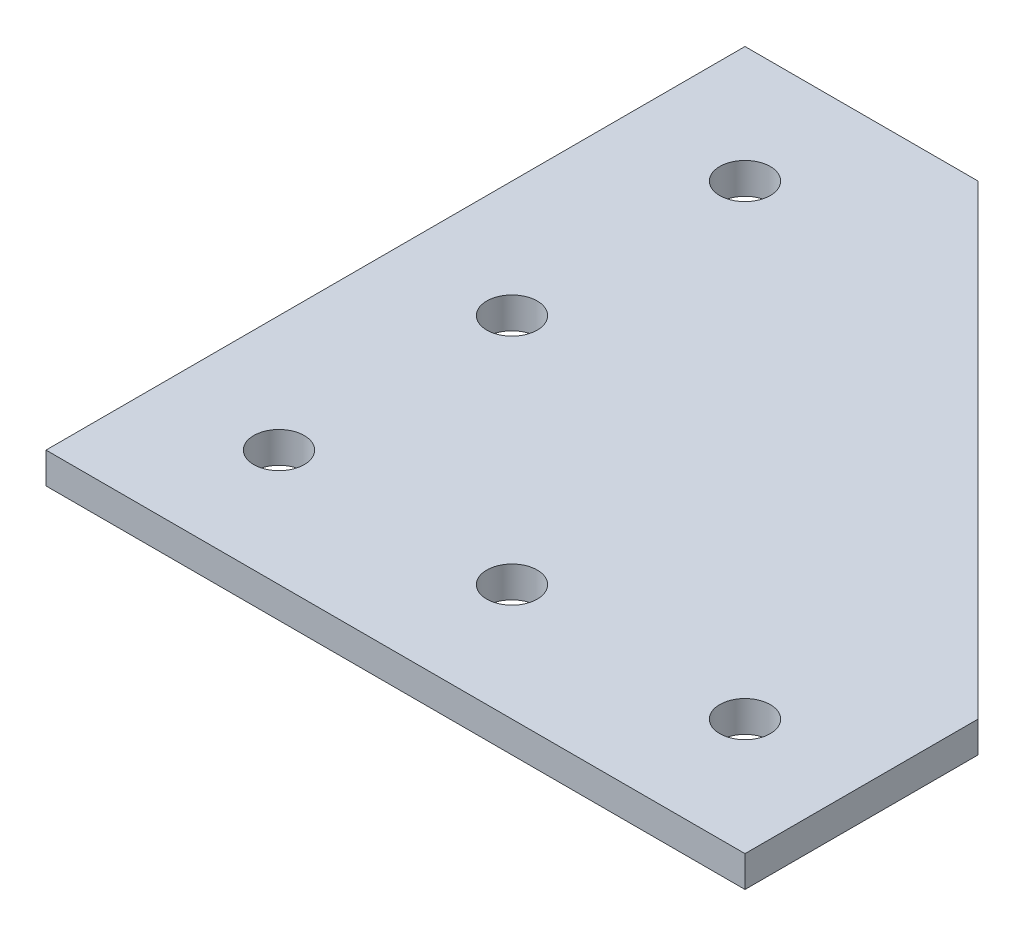
ISO-10303-21;
HEADER;
FILE_DESCRIPTION(('STEP AP214'),'2;1');
FILE_NAME('part.step','',(''),(''),'','','');
FILE_SCHEMA(('AUTOMOTIVE_DESIGN { 1 0 10303 214 1 1 1 1 }'));
ENDSEC;
DATA;
#1=APPLICATION_CONTEXT('core data for automotive mechanical design processes');
#2=APPLICATION_PROTOCOL_DEFINITION('international standard','automotive_design',2000,#1);
#3=PRODUCT_CONTEXT('',#1,'mechanical');
#4=PRODUCT('Part','Part','',(#3));
#5=PRODUCT_RELATED_PRODUCT_CATEGORY('part','',(#4));
#6=PRODUCT_DEFINITION_FORMATION('','',#4);
#7=PRODUCT_DEFINITION_CONTEXT('part definition',#1,'design');
#8=PRODUCT_DEFINITION('design','',#6,#7);
#9=PRODUCT_DEFINITION_SHAPE('','',#8);
#10=(LENGTH_UNIT() NAMED_UNIT(*) SI_UNIT(.MILLI.,.METRE.));
#11=(NAMED_UNIT(*) PLANE_ANGLE_UNIT() SI_UNIT($,.RADIAN.));
#12=(NAMED_UNIT(*) SI_UNIT($,.STERADIAN.) SOLID_ANGLE_UNIT());
#13=UNCERTAINTY_MEASURE_WITH_UNIT(LENGTH_MEASURE(1.E-05),#10,'distance_accuracy_value','');
#14=(GEOMETRIC_REPRESENTATION_CONTEXT(3) GLOBAL_UNCERTAINTY_ASSIGNED_CONTEXT((#13)) GLOBAL_UNIT_ASSIGNED_CONTEXT((#10,
#11,#12)) REPRESENTATION_CONTEXT('',''));
#15=CARTESIAN_POINT('',(0.,0.,0.));
#16=DIRECTION('',(0.,0.,1.));
#17=DIRECTION('',(1.,0.,0.));
#18=AXIS2_PLACEMENT_3D('',#15,#16,#17);
#19=CARTESIAN_POINT('',(0.,4.,-90.));
#20=DIRECTION('',(1.,0.,0.));
#21=DIRECTION('',(0.,0.,-1.));
#22=AXIS2_PLACEMENT_3D('',#19,#20,#21);
#23=PLANE('',#22);
#24=DIRECTION('',(0.,0.,1.));
#25=VECTOR('',#24,1.);
#26=CARTESIAN_POINT('',(0.,0.,-90.));
#27=LINE('',#26,#25);
#28=CARTESIAN_POINT('',(0.,0.,-90.));
#29=VERTEX_POINT('',#28);
#30=CARTESIAN_POINT('',(0.,0.,0.));
#31=VERTEX_POINT('',#30);
#32=EDGE_CURVE('E113',#29,#31,#27,.T.);
#33=ORIENTED_EDGE('',*,*,#32,.T.);
#34=DIRECTION('',(0.,-1.,0.));
#35=VECTOR('',#34,1.);
#36=CARTESIAN_POINT('',(0.,4.,0.));
#37=LINE('',#36,#35);
#38=CARTESIAN_POINT('',(0.,4.,0.));
#39=VERTEX_POINT('',#38);
#40=EDGE_CURVE('E11',#39,#31,#37,.T.);
#41=ORIENTED_EDGE('',*,*,#40,.F.);
#42=DIRECTION('',(0.,0.,1.));
#43=VECTOR('',#42,1.);
#44=CARTESIAN_POINT('',(0.,4.,-90.));
#45=LINE('',#44,#43);
#46=CARTESIAN_POINT('',(0.,4.,-90.));
#47=VERTEX_POINT('',#46);
#48=EDGE_CURVE('E122',#47,#39,#45,.T.);
#49=ORIENTED_EDGE('',*,*,#48,.F.);
#50=DIRECTION('',(0.,-1.,0.));
#51=VECTOR('',#50,1.);
#52=CARTESIAN_POINT('',(0.,4.,-90.));
#53=LINE('',#52,#51);
#54=EDGE_CURVE('E109',#47,#29,#53,.T.);
#55=ORIENTED_EDGE('',*,*,#54,.T.);
#56=EDGE_LOOP('',(#33,#41,#49,#55));
#57=FACE_BOUND('',#56,.T.);
#58=ADVANCED_FACE('F39',(#57),#23,.F.);
#59=CARTESIAN_POINT('',(0.,4.,0.));
#60=DIRECTION('',(0.,0.,-1.));
#61=DIRECTION('',(-1.,0.,0.));
#62=AXIS2_PLACEMENT_3D('',#59,#60,#61);
#63=PLANE('',#62);
#64=DIRECTION('',(1.,0.,0.));
#65=VECTOR('',#64,1.);
#66=CARTESIAN_POINT('',(0.,0.,0.));
#67=LINE('',#66,#65);
#68=CARTESIAN_POINT('',(90.,0.,0.));
#69=VERTEX_POINT('',#68);
#70=EDGE_CURVE('E116',#31,#69,#67,.T.);
#71=ORIENTED_EDGE('',*,*,#70,.T.);
#72=DIRECTION('',(0.,-1.,0.));
#73=VECTOR('',#72,1.);
#74=CARTESIAN_POINT('',(90.,4.,0.));
#75=LINE('',#74,#73);
#76=CARTESIAN_POINT('',(90.,4.,0.));
#77=VERTEX_POINT('',#76);
#78=EDGE_CURVE('E47',#77,#69,#75,.T.);
#79=ORIENTED_EDGE('',*,*,#78,.F.);
#80=DIRECTION('',(1.,0.,0.));
#81=VECTOR('',#80,1.);
#82=CARTESIAN_POINT('',(0.,4.,0.));
#83=LINE('',#82,#81);
#84=EDGE_CURVE('E89',#39,#77,#83,.T.);
#85=ORIENTED_EDGE('',*,*,#84,.F.);
#86=ORIENTED_EDGE('',*,*,#40,.T.);
#87=EDGE_LOOP('',(#71,#79,#85,#86));
#88=FACE_BOUND('',#87,.T.);
#89=ADVANCED_FACE('F142',(#88),#63,.F.);
#90=CARTESIAN_POINT('',(90.,4.,0.));
#91=DIRECTION('',(-1.,0.,0.));
#92=DIRECTION('',(0.,0.,1.));
#93=AXIS2_PLACEMENT_3D('',#90,#91,#92);
#94=PLANE('',#93);
#95=DIRECTION('',(0.,0.,-1.));
#96=VECTOR('',#95,1.);
#97=CARTESIAN_POINT('',(90.,0.,0.));
#98=LINE('',#97,#96);
#99=CARTESIAN_POINT('',(90.,0.,-30.));
#100=VERTEX_POINT('',#99);
#101=EDGE_CURVE('E104',#69,#100,#98,.T.);
#102=ORIENTED_EDGE('',*,*,#101,.T.);
#103=DIRECTION('',(0.,-1.,0.));
#104=VECTOR('',#103,1.);
#105=CARTESIAN_POINT('',(90.,4.,-30.));
#106=LINE('',#105,#104);
#107=CARTESIAN_POINT('',(90.,4.,-30.));
#108=VERTEX_POINT('',#107);
#109=EDGE_CURVE('E101',#108,#100,#106,.T.);
#110=ORIENTED_EDGE('',*,*,#109,.F.);
#111=DIRECTION('',(0.,0.,-1.));
#112=VECTOR('',#111,1.);
#113=CARTESIAN_POINT('',(90.,4.,0.));
#114=LINE('',#113,#112);
#115=EDGE_CURVE('E93',#77,#108,#114,.T.);
#116=ORIENTED_EDGE('',*,*,#115,.F.);
#117=ORIENTED_EDGE('',*,*,#78,.T.);
#118=EDGE_LOOP('',(#102,#110,#116,#117));
#119=FACE_BOUND('',#118,.T.);
#120=ADVANCED_FACE('F102',(#119),#94,.F.);
#121=CARTESIAN_POINT('',(90.,4.,-30.));
#122=DIRECTION('',(-0.707106781186547,0.,0.707106781186547));
#123=DIRECTION('',(0.707106781186548,0.,0.707106781186548));
#124=AXIS2_PLACEMENT_3D('',#121,#122,#123);
#125=PLANE('',#124);
#126=DIRECTION('',(-0.707106781186547,0.,-0.707106781186547));
#127=VECTOR('',#126,1.);
#128=CARTESIAN_POINT('',(90.,0.,-30.));
#129=LINE('',#128,#127);
#130=CARTESIAN_POINT('',(30.,0.,-90.));
#131=VERTEX_POINT('',#130);
#132=EDGE_CURVE('E75',#100,#131,#129,.T.);
#133=ORIENTED_EDGE('',*,*,#132,.T.);
#134=DIRECTION('',(0.,-1.,0.));
#135=VECTOR('',#134,1.);
#136=CARTESIAN_POINT('',(30.,4.,-90.));
#137=LINE('',#136,#135);
#138=CARTESIAN_POINT('',(30.,4.,-90.));
#139=VERTEX_POINT('',#138);
#140=EDGE_CURVE('E105',#139,#131,#137,.T.);
#141=ORIENTED_EDGE('',*,*,#140,.F.);
#142=DIRECTION('',(-0.707106781186547,0.,-0.707106781186547));
#143=VECTOR('',#142,1.);
#144=CARTESIAN_POINT('',(90.,4.,-30.));
#145=LINE('',#144,#143);
#146=EDGE_CURVE('E97',#108,#139,#145,.T.);
#147=ORIENTED_EDGE('',*,*,#146,.F.);
#148=ORIENTED_EDGE('',*,*,#109,.T.);
#149=EDGE_LOOP('',(#133,#141,#147,#148));
#150=FACE_BOUND('',#149,.T.);
#151=ADVANCED_FACE('F107',(#150),#125,.F.);
#152=CARTESIAN_POINT('',(30.,4.,-90.));
#153=DIRECTION('',(0.,0.,1.));
#154=DIRECTION('',(1.,0.,0.));
#155=AXIS2_PLACEMENT_3D('',#152,#153,#154);
#156=PLANE('',#155);
#157=DIRECTION('',(-1.,0.,0.));
#158=VECTOR('',#157,1.);
#159=CARTESIAN_POINT('',(30.,0.,-90.));
#160=LINE('',#159,#158);
#161=EDGE_CURVE('E81',#131,#29,#160,.T.);
#162=ORIENTED_EDGE('',*,*,#161,.T.);
#163=ORIENTED_EDGE('',*,*,#54,.F.);
#164=DIRECTION('',(-1.,0.,0.));
#165=VECTOR('',#164,1.);
#166=CARTESIAN_POINT('',(30.,4.,-90.));
#167=LINE('',#166,#165);
#168=EDGE_CURVE('E55',#139,#47,#167,.T.);
#169=ORIENTED_EDGE('',*,*,#168,.F.);
#170=ORIENTED_EDGE('',*,*,#140,.T.);
#171=EDGE_LOOP('',(#162,#163,#169,#170));
#172=FACE_BOUND('',#171,.T.);
#173=ADVANCED_FACE('F130',(#172),#156,.F.);
#174=CARTESIAN_POINT('',(0.,4.,0.));
#175=DIRECTION('',(0.,1.,0.));
#176=DIRECTION('',(0.,0.,1.));
#177=AXIS2_PLACEMENT_3D('',#174,#175,#176);
#178=PLANE('',#177);
#179=CARTESIAN_POINT('',(14.9999999999998,4.,-75.));
#180=DIRECTION('',(0.,1.,0.));
#181=DIRECTION('',(0.,0.,1.));
#182=AXIS2_PLACEMENT_3D('',#179,#180,#181);
#183=CIRCLE('',#182,3.25);
#184=CARTESIAN_POINT('',(14.9999999999998,4.,-71.75));
#185=VERTEX_POINT('',#184);
#186=EDGE_CURVE('E235',#185,#185,#183,.T.);
#187=ORIENTED_EDGE('',*,*,#186,.F.);
#188=EDGE_LOOP('',(#187));
#189=FACE_BOUND('',#188,.T.);
#190=CARTESIAN_POINT('',(14.9999999999999,4.,-45.));
#191=DIRECTION('',(0.,1.,0.));
#192=DIRECTION('',(0.,0.,1.));
#193=AXIS2_PLACEMENT_3D('',#190,#191,#192);
#194=CIRCLE('',#193,3.25);
#195=CARTESIAN_POINT('',(14.9999999999999,4.,-41.75));
#196=VERTEX_POINT('',#195);
#197=EDGE_CURVE('E239',#196,#196,#194,.T.);
#198=ORIENTED_EDGE('',*,*,#197,.F.);
#199=EDGE_LOOP('',(#198));
#200=FACE_BOUND('',#199,.T.);
#201=CARTESIAN_POINT('',(75.,4.,-15.));
#202=DIRECTION('',(0.,1.,0.));
#203=DIRECTION('',(0.,0.,1.));
#204=AXIS2_PLACEMENT_3D('',#201,#202,#203);
#205=CIRCLE('',#204,3.25000000000001);
#206=CARTESIAN_POINT('',(75.,4.,-11.75));
#207=VERTEX_POINT('',#206);
#208=EDGE_CURVE('E258',#207,#207,#205,.T.);
#209=ORIENTED_EDGE('',*,*,#208,.F.);
#210=EDGE_LOOP('',(#209));
#211=FACE_BOUND('',#210,.T.);
#212=CARTESIAN_POINT('',(45.,4.,-15.));
#213=DIRECTION('',(0.,1.,0.));
#214=DIRECTION('',(0.,0.,1.));
#215=AXIS2_PLACEMENT_3D('',#212,#213,#214);
#216=CIRCLE('',#215,3.25000000000001);
#217=CARTESIAN_POINT('',(45.,4.,-11.75));
#218=VERTEX_POINT('',#217);
#219=EDGE_CURVE('E249',#218,#218,#216,.T.);
#220=ORIENTED_EDGE('',*,*,#219,.F.);
#221=EDGE_LOOP('',(#220));
#222=FACE_BOUND('',#221,.T.);
#223=CARTESIAN_POINT('',(15.,4.,-15.));
#224=DIRECTION('',(0.,1.,0.));
#225=DIRECTION('',(0.,0.,1.));
#226=AXIS2_PLACEMENT_3D('',#223,#224,#225);
#227=CIRCLE('',#226,3.25);
#228=CARTESIAN_POINT('',(15.,4.,-11.75));
#229=VERTEX_POINT('',#228);
#230=EDGE_CURVE('E246',#229,#229,#227,.T.);
#231=ORIENTED_EDGE('',*,*,#230,.F.);
#232=EDGE_LOOP('',(#231));
#233=FACE_BOUND('',#232,.T.);
#234=ORIENTED_EDGE('',*,*,#48,.T.);
#235=ORIENTED_EDGE('',*,*,#84,.T.);
#236=ORIENTED_EDGE('',*,*,#115,.T.);
#237=ORIENTED_EDGE('',*,*,#146,.T.);
#238=ORIENTED_EDGE('',*,*,#168,.T.);
#239=EDGE_LOOP('',(#234,#235,#236,#237,#238));
#240=FACE_BOUND('',#239,.T.);
#241=ADVANCED_FACE('F95',(#189,#200,#211,#222,#233,#240),#178,.T.);
#242=CARTESIAN_POINT('',(0.,0.,0.));
#243=DIRECTION('',(0.,1.,0.));
#244=DIRECTION('',(0.,0.,1.));
#245=AXIS2_PLACEMENT_3D('',#242,#243,#244);
#246=PLANE('',#245);
#247=CARTESIAN_POINT('',(14.9999999999998,0.,-75.));
#248=DIRECTION('',(0.,1.,0.));
#249=DIRECTION('',(0.,0.,1.));
#250=AXIS2_PLACEMENT_3D('',#247,#248,#249);
#251=CIRCLE('',#250,3.25);
#252=CARTESIAN_POINT('',(14.9999999999998,0.,-71.75));
#253=VERTEX_POINT('',#252);
#254=EDGE_CURVE('E232',#253,#253,#251,.T.);
#255=ORIENTED_EDGE('',*,*,#254,.T.);
#256=EDGE_LOOP('',(#255));
#257=FACE_BOUND('',#256,.T.);
#258=CARTESIAN_POINT('',(14.9999999999999,0.,-45.));
#259=DIRECTION('',(0.,1.,0.));
#260=DIRECTION('',(0.,0.,1.));
#261=AXIS2_PLACEMENT_3D('',#258,#259,#260);
#262=CIRCLE('',#261,3.25);
#263=CARTESIAN_POINT('',(14.9999999999999,0.,-41.75));
#264=VERTEX_POINT('',#263);
#265=EDGE_CURVE('E236',#264,#264,#262,.T.);
#266=ORIENTED_EDGE('',*,*,#265,.T.);
#267=EDGE_LOOP('',(#266));
#268=FACE_BOUND('',#267,.T.);
#269=CARTESIAN_POINT('',(75.,0.,-15.));
#270=DIRECTION('',(0.,1.,0.));
#271=DIRECTION('',(0.,0.,1.));
#272=AXIS2_PLACEMENT_3D('',#269,#270,#271);
#273=CIRCLE('',#272,3.25000000000001);
#274=CARTESIAN_POINT('',(75.,0.,-11.75));
#275=VERTEX_POINT('',#274);
#276=EDGE_CURVE('E263',#275,#275,#273,.T.);
#277=ORIENTED_EDGE('',*,*,#276,.T.);
#278=EDGE_LOOP('',(#277));
#279=FACE_BOUND('',#278,.T.);
#280=CARTESIAN_POINT('',(45.,0.,-15.));
#281=DIRECTION('',(0.,1.,0.));
#282=DIRECTION('',(0.,0.,1.));
#283=AXIS2_PLACEMENT_3D('',#280,#281,#282);
#284=CIRCLE('',#283,3.25000000000001);
#285=CARTESIAN_POINT('',(45.,0.,-11.75));
#286=VERTEX_POINT('',#285);
#287=EDGE_CURVE('E253',#286,#286,#284,.T.);
#288=ORIENTED_EDGE('',*,*,#287,.T.);
#289=EDGE_LOOP('',(#288));
#290=FACE_BOUND('',#289,.T.);
#291=CARTESIAN_POINT('',(15.,0.,-15.));
#292=DIRECTION('',(0.,1.,0.));
#293=DIRECTION('',(0.,0.,1.));
#294=AXIS2_PLACEMENT_3D('',#291,#292,#293);
#295=CIRCLE('',#294,3.25);
#296=CARTESIAN_POINT('',(15.,0.,-11.75));
#297=VERTEX_POINT('',#296);
#298=EDGE_CURVE('E117',#297,#297,#295,.T.);
#299=ORIENTED_EDGE('',*,*,#298,.T.);
#300=EDGE_LOOP('',(#299));
#301=FACE_BOUND('',#300,.T.);
#302=ORIENTED_EDGE('',*,*,#32,.F.);
#303=ORIENTED_EDGE('',*,*,#161,.F.);
#304=ORIENTED_EDGE('',*,*,#132,.F.);
#305=ORIENTED_EDGE('',*,*,#101,.F.);
#306=ORIENTED_EDGE('',*,*,#70,.F.);
#307=EDGE_LOOP('',(#302,#303,#304,#305,#306));
#308=FACE_BOUND('',#307,.T.);
#309=ADVANCED_FACE('F126',(#257,#268,#279,#290,#301,#308),#246,.F.);
#310=CARTESIAN_POINT('',(15.,0.,-15.));
#311=DIRECTION('',(0.,1.,0.));
#312=DIRECTION('',(0.,0.,1.));
#313=AXIS2_PLACEMENT_3D('',#310,#311,#312);
#314=CYLINDRICAL_SURFACE('',#313,3.25);
#315=ORIENTED_EDGE('',*,*,#298,.F.);
#316=EDGE_LOOP('',(#315));
#317=FACE_BOUND('',#316,.T.);
#318=ORIENTED_EDGE('',*,*,#230,.T.);
#319=EDGE_LOOP('',(#318));
#320=FACE_BOUND('',#319,.T.);
#321=ADVANCED_FACE('F177',(#317,#320),#314,.F.);
#322=CARTESIAN_POINT('',(45.,0.,-15.));
#323=DIRECTION('',(0.,1.,0.));
#324=DIRECTION('',(0.,0.,1.));
#325=AXIS2_PLACEMENT_3D('',#322,#323,#324);
#326=CYLINDRICAL_SURFACE('',#325,3.25000000000001);
#327=ORIENTED_EDGE('',*,*,#287,.F.);
#328=EDGE_LOOP('',(#327));
#329=FACE_BOUND('',#328,.T.);
#330=ORIENTED_EDGE('',*,*,#219,.T.);
#331=EDGE_LOOP('',(#330));
#332=FACE_BOUND('',#331,.T.);
#333=ADVANCED_FACE('F186',(#329,#332),#326,.F.);
#334=CARTESIAN_POINT('',(75.,0.,-15.));
#335=DIRECTION('',(0.,1.,0.));
#336=DIRECTION('',(0.,0.,1.));
#337=AXIS2_PLACEMENT_3D('',#334,#335,#336);
#338=CYLINDRICAL_SURFACE('',#337,3.25000000000001);
#339=ORIENTED_EDGE('',*,*,#276,.F.);
#340=EDGE_LOOP('',(#339));
#341=FACE_BOUND('',#340,.T.);
#342=ORIENTED_EDGE('',*,*,#208,.T.);
#343=EDGE_LOOP('',(#342));
#344=FACE_BOUND('',#343,.T.);
#345=ADVANCED_FACE('F196',(#341,#344),#338,.F.);
#346=CARTESIAN_POINT('',(14.9999999999999,0.,-45.));
#347=DIRECTION('',(0.,1.,0.));
#348=DIRECTION('',(0.,0.,1.));
#349=AXIS2_PLACEMENT_3D('',#346,#347,#348);
#350=CYLINDRICAL_SURFACE('',#349,3.25);
#351=ORIENTED_EDGE('',*,*,#265,.F.);
#352=EDGE_LOOP('',(#351));
#353=FACE_BOUND('',#352,.T.);
#354=ORIENTED_EDGE('',*,*,#197,.T.);
#355=EDGE_LOOP('',(#354));
#356=FACE_BOUND('',#355,.T.);
#357=ADVANCED_FACE('F206',(#353,#356),#350,.F.);
#358=CARTESIAN_POINT('',(14.9999999999998,0.,-75.));
#359=DIRECTION('',(0.,1.,0.));
#360=DIRECTION('',(0.,0.,1.));
#361=AXIS2_PLACEMENT_3D('',#358,#359,#360);
#362=CYLINDRICAL_SURFACE('',#361,3.25);
#363=ORIENTED_EDGE('',*,*,#254,.F.);
#364=EDGE_LOOP('',(#363));
#365=FACE_BOUND('',#364,.T.);
#366=ORIENTED_EDGE('',*,*,#186,.T.);
#367=EDGE_LOOP('',(#366));
#368=FACE_BOUND('',#367,.T.);
#369=ADVANCED_FACE('F216',(#365,#368),#362,.F.);
#370=CLOSED_SHELL('',(#58,#89,#120,#151,#173,#241,#309,#321,#333,#345,#357,#369));
#371=MANIFOLD_SOLID_BREP('B2',#370);
#372=ADVANCED_BREP_SHAPE_REPRESENTATION('',(#18,#371),#14);
#373=SHAPE_DEFINITION_REPRESENTATION(#9,#372);
ENDSEC;
END-ISO-10303-21;
